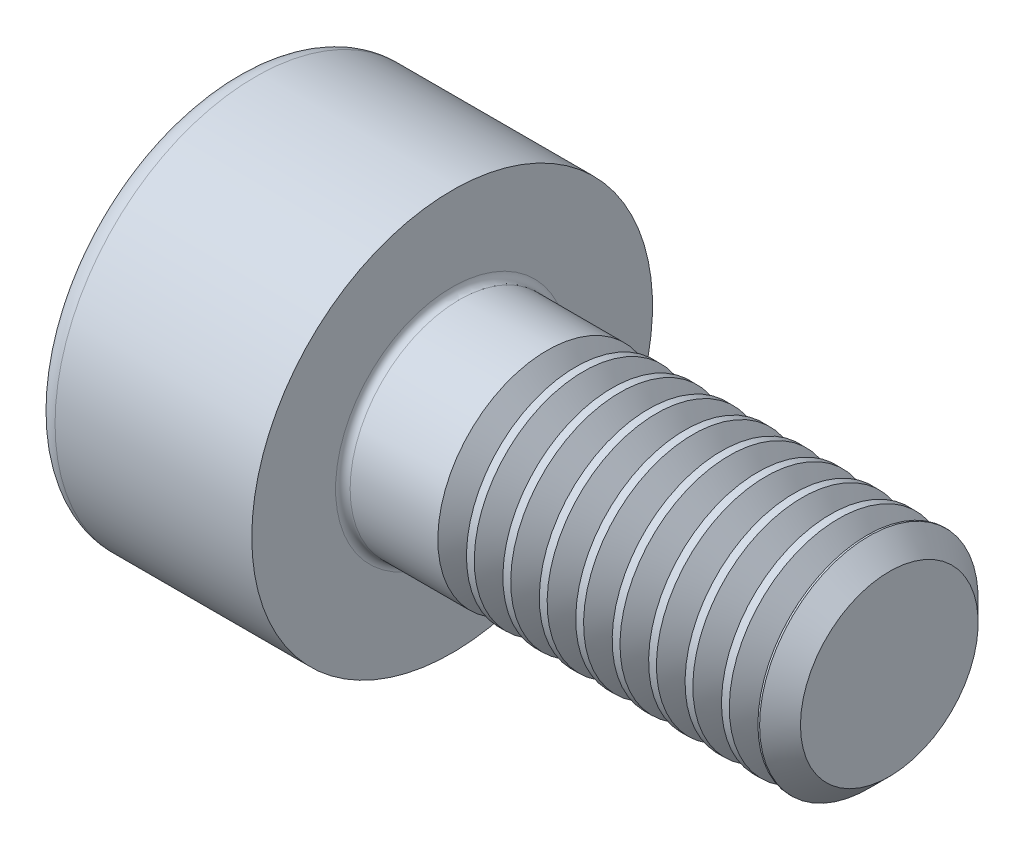
ISO-10303-21;
HEADER;
FILE_DESCRIPTION(('STEP AP214'),'2;1');
FILE_NAME('part.step','',(''),(''),'','','');
FILE_SCHEMA(('AUTOMOTIVE_DESIGN { 1 0 10303 214 1 1 1 1 }'));
ENDSEC;
DATA;
#1=APPLICATION_CONTEXT('core data for automotive mechanical design processes');
#2=APPLICATION_PROTOCOL_DEFINITION('international standard','automotive_design',2000,#1);
#3=PRODUCT_CONTEXT('',#1,'mechanical');
#4=PRODUCT('Part','Part','',(#3));
#5=PRODUCT_RELATED_PRODUCT_CATEGORY('part','',(#4));
#6=PRODUCT_DEFINITION_FORMATION('','',#4);
#7=PRODUCT_DEFINITION_CONTEXT('part definition',#1,'design');
#8=PRODUCT_DEFINITION('design','',#6,#7);
#9=PRODUCT_DEFINITION_SHAPE('','',#8);
#10=(LENGTH_UNIT() NAMED_UNIT(*) SI_UNIT(.MILLI.,.METRE.));
#11=(NAMED_UNIT(*) PLANE_ANGLE_UNIT() SI_UNIT($,.RADIAN.));
#12=(NAMED_UNIT(*) SI_UNIT($,.STERADIAN.) SOLID_ANGLE_UNIT());
#13=UNCERTAINTY_MEASURE_WITH_UNIT(LENGTH_MEASURE(1.E-05),#10,'distance_accuracy_value','');
#14=(GEOMETRIC_REPRESENTATION_CONTEXT(3) GLOBAL_UNCERTAINTY_ASSIGNED_CONTEXT((#13)) GLOBAL_UNIT_ASSIGNED_CONTEXT((#10,
#11,#12)) REPRESENTATION_CONTEXT('',''));
#15=CARTESIAN_POINT('',(0.,0.,0.));
#16=DIRECTION('',(0.,0.,1.));
#17=DIRECTION('',(1.,0.,0.));
#18=AXIS2_PLACEMENT_3D('',#15,#16,#17);
#19=CARTESIAN_POINT('',(0.,0.,0.));
#20=DIRECTION('',(-1.,0.,0.));
#21=DIRECTION('',(0.,0.,1.));
#22=AXIS2_PLACEMENT_3D('',#19,#20,#21);
#23=PLANE('',#22);
#24=DIRECTION('',(0.,-0.499999999999999,0.866025403784439));
#25=VECTOR('',#24,1.);
#26=CARTESIAN_POINT('',(0.,1.45492267835785,0.));
#27=LINE('',#26,#25);
#28=CARTESIAN_POINT('',(0.,1.45492267835785,0.));
#29=VERTEX_POINT('',#28);
#30=CARTESIAN_POINT('',(0.,0.727461339178925,1.26));
#31=VERTEX_POINT('',#30);
#32=EDGE_CURVE('E389',#29,#31,#27,.T.);
#33=ORIENTED_EDGE('',*,*,#32,.T.);
#34=DIRECTION('',(0.,1.,0.));
#35=VECTOR('',#34,1.);
#36=CARTESIAN_POINT('',(0.,-0.727461339178932,1.26));
#37=LINE('',#36,#35);
#38=CARTESIAN_POINT('',(0.,-0.727461339178932,1.26));
#39=VERTEX_POINT('',#38);
#40=EDGE_CURVE('E130',#39,#31,#37,.T.);
#41=ORIENTED_EDGE('',*,*,#40,.F.);
#42=DIRECTION('',(0.,-0.500000000000001,-0.866025403784438));
#43=VECTOR('',#42,1.);
#44=CARTESIAN_POINT('',(0.,-0.727461339178932,1.26));
#45=LINE('',#44,#43);
#46=CARTESIAN_POINT('',(0.,-1.45492267835786,0.));
#47=VERTEX_POINT('',#46);
#48=EDGE_CURVE('E408',#39,#47,#45,.T.);
#49=ORIENTED_EDGE('',*,*,#48,.T.);
#50=DIRECTION('',(0.,0.499999999999999,-0.866025403784439));
#51=VECTOR('',#50,1.);
#52=CARTESIAN_POINT('',(0.,-1.45492267835786,0.));
#53=LINE('',#52,#51);
#54=CARTESIAN_POINT('',(0.,-0.727461339178935,-1.26));
#55=VERTEX_POINT('',#54);
#56=EDGE_CURVE('E411',#47,#55,#53,.T.);
#57=ORIENTED_EDGE('',*,*,#56,.T.);
#58=DIRECTION('',(0.,-1.,0.));
#59=VECTOR('',#58,1.);
#60=CARTESIAN_POINT('',(0.,0.727461339178922,-1.26));
#61=LINE('',#60,#59);
#62=CARTESIAN_POINT('',(0.,0.727461339178922,-1.26));
#63=VERTEX_POINT('',#62);
#64=EDGE_CURVE('E414',#63,#55,#61,.T.);
#65=ORIENTED_EDGE('',*,*,#64,.F.);
#66=DIRECTION('',(0.,-0.500000000000001,-0.866025403784438));
#67=VECTOR('',#66,1.);
#68=CARTESIAN_POINT('',(0.,1.45492267835785,0.));
#69=LINE('',#68,#67);
#70=EDGE_CURVE('E125',#29,#63,#69,.T.);
#71=ORIENTED_EDGE('',*,*,#70,.F.);
#72=EDGE_LOOP('',(#33,#41,#49,#57,#65,#71));
#73=FACE_BOUND('',#72,.T.);
#74=CARTESIAN_POINT('',(0.,0.,0.));
#75=DIRECTION('',(-1.,0.,0.));
#76=DIRECTION('',(0.,0.,1.));
#77=AXIS2_PLACEMENT_3D('',#74,#75,#76);
#78=CIRCLE('',#77,2.45);
#79=CARTESIAN_POINT('',(0.,0.,2.45));
#80=VERTEX_POINT('',#79);
#81=EDGE_CURVE('E42',#80,#80,#78,.T.);
#82=ORIENTED_EDGE('',*,*,#81,.T.);
#83=EDGE_LOOP('',(#82));
#84=FACE_BOUND('',#83,.T.);
#85=ADVANCED_FACE('F34',(#73,#84),#23,.T.);
#86=CARTESIAN_POINT('',(-31.75,0.,0.));
#87=DIRECTION('',(-1.,0.,0.));
#88=DIRECTION('',(0.,0.,1.));
#89=AXIS2_PLACEMENT_3D('',#86,#87,#88);
#90=CYLINDRICAL_SURFACE('',#89,2.75);
#91=CARTESIAN_POINT('',(0.300000000000002,0.,0.));
#92=DIRECTION('',(-1.,0.,0.));
#93=DIRECTION('',(0.,0.,1.));
#94=AXIS2_PLACEMENT_3D('',#91,#92,#93);
#95=CIRCLE('',#94,2.75);
#96=CARTESIAN_POINT('',(0.300000000000002,0.,2.75));
#97=VERTEX_POINT('',#96);
#98=EDGE_CURVE('E11',#97,#97,#95,.F.);
#99=ORIENTED_EDGE('',*,*,#98,.T.);
#100=EDGE_LOOP('',(#99));
#101=FACE_BOUND('',#100,.T.);
#102=CARTESIAN_POINT('',(3.,0.,0.));
#103=DIRECTION('',(-1.,0.,0.));
#104=DIRECTION('',(0.,0.,1.));
#105=AXIS2_PLACEMENT_3D('',#102,#103,#104);
#106=CIRCLE('',#105,2.75);
#107=CARTESIAN_POINT('',(3.,0.,2.75));
#108=VERTEX_POINT('',#107);
#109=EDGE_CURVE('E148',#108,#108,#106,.T.);
#110=ORIENTED_EDGE('',*,*,#109,.T.);
#111=EDGE_LOOP('',(#110));
#112=FACE_BOUND('',#111,.T.);
#113=ADVANCED_FACE('F172',(#101,#112),#90,.T.);
#114=CARTESIAN_POINT('',(3.,2.75,0.));
#115=DIRECTION('',(1.,0.,0.));
#116=DIRECTION('',(0.,0.,-1.));
#117=AXIS2_PLACEMENT_3D('',#114,#115,#116);
#118=PLANE('',#117);
#119=CARTESIAN_POINT('',(3.,0.,0.));
#120=DIRECTION('',(1.,0.,0.));
#121=DIRECTION('',(0.,0.,-1.));
#122=AXIS2_PLACEMENT_3D('',#119,#120,#121);
#123=CIRCLE('',#122,1.6);
#124=CARTESIAN_POINT('',(3.,0.,-1.6));
#125=VERTEX_POINT('',#124);
#126=EDGE_CURVE('E151',#125,#125,#123,.F.);
#127=ORIENTED_EDGE('',*,*,#126,.T.);
#128=EDGE_LOOP('',(#127));
#129=FACE_BOUND('',#128,.T.);
#130=ORIENTED_EDGE('',*,*,#109,.F.);
#131=EDGE_LOOP('',(#130));
#132=FACE_BOUND('',#131,.T.);
#133=ADVANCED_FACE('F178',(#129,#132),#118,.T.);
#134=CARTESIAN_POINT('',(-31.75,0.,0.));
#135=DIRECTION('',(-1.,0.,0.));
#136=DIRECTION('',(0.,0.,1.));
#137=AXIS2_PLACEMENT_3D('',#134,#135,#136);
#138=CYLINDRICAL_SURFACE('',#137,1.5);
#139=CARTESIAN_POINT('',(4.30359178553217,0.,0.));
#140=DIRECTION('',(-1.,0.,0.));
#141=DIRECTION('',(0.,-1.,0.));
#142=AXIS2_PLACEMENT_3D('',#139,#140,#141);
#143=CIRCLE('',#142,1.5);
#144=CARTESIAN_POINT('',(4.30359178553217,-1.5,0.));
#145=VERTEX_POINT('',#144);
#146=EDGE_CURVE('E384',#145,#145,#143,.T.);
#147=ORIENTED_EDGE('',*,*,#146,.T.);
#148=EDGE_LOOP('',(#147));
#149=FACE_BOUND('',#148,.T.);
#150=CARTESIAN_POINT('',(3.10000000000001,0.,0.));
#151=DIRECTION('',(1.,0.,0.));
#152=DIRECTION('',(0.,0.,-1.));
#153=AXIS2_PLACEMENT_3D('',#150,#151,#152);
#154=CIRCLE('',#153,1.5);
#155=CARTESIAN_POINT('',(3.10000000000001,0.,-1.5));
#156=VERTEX_POINT('',#155);
#157=EDGE_CURVE('E154',#156,#156,#154,.T.);
#158=ORIENTED_EDGE('',*,*,#157,.T.);
#159=EDGE_LOOP('',(#158));
#160=FACE_BOUND('',#159,.T.);
#161=ADVANCED_FACE('F168',(#149,#160),#138,.T.);
#162=CARTESIAN_POINT('',(3.10000000000001,0.,0.));
#163=DIRECTION('',(1.,0.,0.));
#164=DIRECTION('',(0.,0.,-1.));
#165=AXIS2_PLACEMENT_3D('',#162,#163,#164);
#166=TOROIDAL_SURFACE('',#165,1.6,0.1);
#167=ORIENTED_EDGE('',*,*,#157,.F.);
#168=EDGE_LOOP('',(#167));
#169=FACE_BOUND('',#168,.T.);
#170=ORIENTED_EDGE('',*,*,#126,.F.);
#171=EDGE_LOOP('',(#170));
#172=FACE_BOUND('',#171,.T.);
#173=ADVANCED_FACE('F161',(#169,#172),#166,.F.);
#174=CARTESIAN_POINT('',(0.300000000000002,0.,0.));
#175=DIRECTION('',(-1.,0.,0.));
#176=DIRECTION('',(0.,0.,1.));
#177=AXIS2_PLACEMENT_3D('',#174,#175,#176);
#178=TOROIDAL_SURFACE('',#177,2.45,0.3);
#179=ORIENTED_EDGE('',*,*,#98,.F.);
#180=EDGE_LOOP('',(#179));
#181=FACE_BOUND('',#180,.T.);
#182=ORIENTED_EDGE('',*,*,#81,.F.);
#183=EDGE_LOOP('',(#182));
#184=FACE_BOUND('',#183,.T.);
#185=ADVANCED_FACE('F36',(#181,#184),#178,.T.);
#186=CARTESIAN_POINT('',(1.3,1.45492267835785,0.));
#187=DIRECTION('',(0.,-0.866025403784439,-0.499999999999999));
#188=DIRECTION('',(0.,0.499999999999999,-0.866025403784439));
#189=AXIS2_PLACEMENT_3D('',#186,#187,#188);
#190=PLANE('',#189);
#191=ORIENTED_EDGE('',*,*,#32,.F.);
#192=DIRECTION('',(-1.,0.,0.));
#193=VECTOR('',#192,1.);
#194=CARTESIAN_POINT('',(1.3,1.45492267835785,0.));
#195=LINE('',#194,#193);
#196=CARTESIAN_POINT('',(1.3,1.45492267835785,0.));
#197=VERTEX_POINT('',#196);
#198=EDGE_CURVE('E405',#197,#29,#195,.T.);
#199=ORIENTED_EDGE('',*,*,#198,.F.);
#200=DIRECTION('',(0.,-0.499999999999999,0.866025403784439));
#201=VECTOR('',#200,1.);
#202=CARTESIAN_POINT('',(1.3,1.45492267835785,0.));
#203=LINE('',#202,#201);
#204=CARTESIAN_POINT('',(1.3,1.09119200876839,0.629999999999996));
#205=VERTEX_POINT('',#204);
#206=EDGE_CURVE('E117',#197,#205,#203,.T.);
#207=ORIENTED_EDGE('',*,*,#206,.T.);
#208=CARTESIAN_POINT('',(1.3,0.727461339178925,1.26));
#209=VERTEX_POINT('',#208);
#210=EDGE_CURVE('E108',#205,#209,#203,.T.);
#211=ORIENTED_EDGE('',*,*,#210,.T.);
#212=DIRECTION('',(-1.,0.,0.));
#213=VECTOR('',#212,1.);
#214=CARTESIAN_POINT('',(1.3,0.727461339178925,1.26));
#215=LINE('',#214,#213);
#216=EDGE_CURVE('E122',#209,#31,#215,.T.);
#217=ORIENTED_EDGE('',*,*,#216,.T.);
#218=EDGE_LOOP('',(#191,#199,#207,#211,#217));
#219=FACE_BOUND('',#218,.T.);
#220=ADVANCED_FACE('F121',(#219),#190,.T.);
#221=CARTESIAN_POINT('',(1.3,-0.727461339178932,1.26));
#222=DIRECTION('',(0.,0.,1.));
#223=DIRECTION('',(0.,-1.,0.));
#224=AXIS2_PLACEMENT_3D('',#221,#222,#223);
#225=PLANE('',#224);
#226=ORIENTED_EDGE('',*,*,#40,.T.);
#227=ORIENTED_EDGE('',*,*,#216,.F.);
#228=DIRECTION('',(0.,1.,0.));
#229=VECTOR('',#228,1.);
#230=CARTESIAN_POINT('',(1.3,-0.727461339178932,1.26));
#231=LINE('',#230,#229);
#232=CARTESIAN_POINT('',(1.3,0.,1.26));
#233=VERTEX_POINT('',#232);
#234=EDGE_CURVE('E105',#233,#209,#231,.T.);
#235=ORIENTED_EDGE('',*,*,#234,.F.);
#236=CARTESIAN_POINT('',(1.3,-0.727461339178932,1.26));
#237=VERTEX_POINT('',#236);
#238=EDGE_CURVE('E116',#237,#233,#231,.T.);
#239=ORIENTED_EDGE('',*,*,#238,.F.);
#240=DIRECTION('',(-1.,0.,0.));
#241=VECTOR('',#240,1.);
#242=CARTESIAN_POINT('',(1.3,-0.727461339178932,1.26));
#243=LINE('',#242,#241);
#244=EDGE_CURVE('E132',#237,#39,#243,.T.);
#245=ORIENTED_EDGE('',*,*,#244,.T.);
#246=EDGE_LOOP('',(#226,#227,#235,#239,#245));
#247=FACE_BOUND('',#246,.T.);
#248=ADVANCED_FACE('F127',(#247),#225,.F.);
#249=CARTESIAN_POINT('',(1.3,-0.727461339178932,1.26));
#250=DIRECTION('',(0.,0.866025403784438,-0.500000000000001));
#251=DIRECTION('',(0.,0.500000000000001,0.866025403784438));
#252=AXIS2_PLACEMENT_3D('',#249,#250,#251);
#253=PLANE('',#252);
#254=ORIENTED_EDGE('',*,*,#48,.F.);
#255=ORIENTED_EDGE('',*,*,#244,.F.);
#256=DIRECTION('',(0.,-0.500000000000001,-0.866025403784438));
#257=VECTOR('',#256,1.);
#258=CARTESIAN_POINT('',(1.3,-0.727461339178932,1.26));
#259=LINE('',#258,#257);
#260=CARTESIAN_POINT('',(1.3,-1.0911920087684,0.630000000000003));
#261=VERTEX_POINT('',#260);
#262=EDGE_CURVE('E392',#237,#261,#259,.T.);
#263=ORIENTED_EDGE('',*,*,#262,.T.);
#264=CARTESIAN_POINT('',(1.3,-1.45492267835786,0.));
#265=VERTEX_POINT('',#264);
#266=EDGE_CURVE('E391',#261,#265,#259,.T.);
#267=ORIENTED_EDGE('',*,*,#266,.T.);
#268=DIRECTION('',(-1.,0.,0.));
#269=VECTOR('',#268,1.);
#270=CARTESIAN_POINT('',(1.3,-1.45492267835786,0.));
#271=LINE('',#270,#269);
#272=EDGE_CURVE('E137',#265,#47,#271,.T.);
#273=ORIENTED_EDGE('',*,*,#272,.T.);
#274=EDGE_LOOP('',(#254,#255,#263,#267,#273));
#275=FACE_BOUND('',#274,.T.);
#276=ADVANCED_FACE('F206',(#275),#253,.T.);
#277=CARTESIAN_POINT('',(1.3,-1.45492267835786,0.));
#278=DIRECTION('',(0.,0.866025403784439,0.499999999999999));
#279=DIRECTION('',(0.,-0.499999999999999,0.866025403784439));
#280=AXIS2_PLACEMENT_3D('',#277,#278,#279);
#281=PLANE('',#280);
#282=ORIENTED_EDGE('',*,*,#56,.F.);
#283=ORIENTED_EDGE('',*,*,#272,.F.);
#284=DIRECTION('',(0.,0.499999999999999,-0.866025403784439));
#285=VECTOR('',#284,1.);
#286=CARTESIAN_POINT('',(1.3,-1.45492267835786,0.));
#287=LINE('',#286,#285);
#288=CARTESIAN_POINT('',(1.3,-1.0911920087684,-0.630000000000001));
#289=VERTEX_POINT('',#288);
#290=EDGE_CURVE('E396',#265,#289,#287,.T.);
#291=ORIENTED_EDGE('',*,*,#290,.T.);
#292=CARTESIAN_POINT('',(1.3,-0.727461339178935,-1.26));
#293=VERTEX_POINT('',#292);
#294=EDGE_CURVE('E395',#289,#293,#287,.T.);
#295=ORIENTED_EDGE('',*,*,#294,.T.);
#296=DIRECTION('',(-1.,0.,0.));
#297=VECTOR('',#296,1.);
#298=CARTESIAN_POINT('',(1.3,-0.727461339178935,-1.26));
#299=LINE('',#298,#297);
#300=EDGE_CURVE('E423',#293,#55,#299,.T.);
#301=ORIENTED_EDGE('',*,*,#300,.T.);
#302=EDGE_LOOP('',(#282,#283,#291,#295,#301));
#303=FACE_BOUND('',#302,.T.);
#304=ADVANCED_FACE('F209',(#303),#281,.T.);
#305=CARTESIAN_POINT('',(1.3,0.727461339178922,-1.26));
#306=DIRECTION('',(0.,0.,-1.));
#307=DIRECTION('',(0.,1.,0.));
#308=AXIS2_PLACEMENT_3D('',#305,#306,#307);
#309=PLANE('',#308);
#310=ORIENTED_EDGE('',*,*,#64,.T.);
#311=ORIENTED_EDGE('',*,*,#300,.F.);
#312=DIRECTION('',(0.,-1.,0.));
#313=VECTOR('',#312,1.);
#314=CARTESIAN_POINT('',(1.3,0.727461339178922,-1.26));
#315=LINE('',#314,#313);
#316=CARTESIAN_POINT('',(1.3,0.,-1.26));
#317=VERTEX_POINT('',#316);
#318=EDGE_CURVE('E399',#317,#293,#315,.T.);
#319=ORIENTED_EDGE('',*,*,#318,.F.);
#320=CARTESIAN_POINT('',(1.3,0.727461339178922,-1.26));
#321=VERTEX_POINT('',#320);
#322=EDGE_CURVE('E49',#321,#317,#315,.T.);
#323=ORIENTED_EDGE('',*,*,#322,.F.);
#324=DIRECTION('',(-1.,0.,0.));
#325=VECTOR('',#324,1.);
#326=CARTESIAN_POINT('',(1.3,0.727461339178922,-1.26));
#327=LINE('',#326,#325);
#328=EDGE_CURVE('E420',#321,#63,#327,.T.);
#329=ORIENTED_EDGE('',*,*,#328,.T.);
#330=EDGE_LOOP('',(#310,#311,#319,#323,#329));
#331=FACE_BOUND('',#330,.T.);
#332=ADVANCED_FACE('F213',(#331),#309,.F.);
#333=CARTESIAN_POINT('',(1.3,1.45492267835785,0.));
#334=DIRECTION('',(0.,0.866025403784438,-0.500000000000001));
#335=DIRECTION('',(0.,0.500000000000001,0.866025403784438));
#336=AXIS2_PLACEMENT_3D('',#333,#334,#335);
#337=PLANE('',#336);
#338=ORIENTED_EDGE('',*,*,#70,.T.);
#339=ORIENTED_EDGE('',*,*,#328,.F.);
#340=DIRECTION('',(0.,-0.500000000000001,-0.866025403784438));
#341=VECTOR('',#340,1.);
#342=CARTESIAN_POINT('',(1.3,1.45492267835785,0.));
#343=LINE('',#342,#341);
#344=CARTESIAN_POINT('',(1.3,1.09119200876839,-0.629999999999999));
#345=VERTEX_POINT('',#344);
#346=EDGE_CURVE('E401',#345,#321,#343,.T.);
#347=ORIENTED_EDGE('',*,*,#346,.F.);
#348=EDGE_CURVE('E402',#197,#345,#343,.T.);
#349=ORIENTED_EDGE('',*,*,#348,.F.);
#350=ORIENTED_EDGE('',*,*,#198,.T.);
#351=EDGE_LOOP('',(#338,#339,#347,#349,#350));
#352=FACE_BOUND('',#351,.T.);
#353=ADVANCED_FACE('F217',(#352),#337,.F.);
#354=CARTESIAN_POINT('',(1.3,2.18238401753678,-1.26));
#355=DIRECTION('',(1.,0.,0.));
#356=DIRECTION('',(0.,0.,-1.));
#357=AXIS2_PLACEMENT_3D('',#354,#355,#356);
#358=PLANE('',#357);
#359=ORIENTED_EDGE('',*,*,#318,.T.);
#360=ORIENTED_EDGE('',*,*,#294,.F.);
#361=CARTESIAN_POINT('',(1.3,0.,0.));
#362=DIRECTION('',(-1.,0.,0.));
#363=DIRECTION('',(0.,0.,1.));
#364=AXIS2_PLACEMENT_3D('',#361,#362,#363);
#365=CIRCLE('',#364,1.26);
#366=EDGE_CURVE('E440',#317,#289,#365,.T.);
#367=ORIENTED_EDGE('',*,*,#366,.F.);
#368=EDGE_LOOP('',(#359,#360,#367));
#369=FACE_BOUND('',#368,.T.);
#370=ADVANCED_FACE('F221',(#369),#358,.F.);
#371=ORIENTED_EDGE('',*,*,#290,.F.);
#372=ORIENTED_EDGE('',*,*,#266,.F.);
#373=EDGE_CURVE('E135',#289,#261,#365,.T.);
#374=ORIENTED_EDGE('',*,*,#373,.F.);
#375=EDGE_LOOP('',(#371,#372,#374));
#376=FACE_BOUND('',#375,.T.);
#377=ADVANCED_FACE('F225',(#376),#358,.F.);
#378=ORIENTED_EDGE('',*,*,#262,.F.);
#379=ORIENTED_EDGE('',*,*,#238,.T.);
#380=EDGE_CURVE('E131',#261,#233,#365,.T.);
#381=ORIENTED_EDGE('',*,*,#380,.F.);
#382=EDGE_LOOP('',(#378,#379,#381));
#383=FACE_BOUND('',#382,.T.);
#384=ADVANCED_FACE('F449',(#383),#358,.F.);
#385=ORIENTED_EDGE('',*,*,#234,.T.);
#386=ORIENTED_EDGE('',*,*,#210,.F.);
#387=EDGE_CURVE('E111',#233,#205,#365,.T.);
#388=ORIENTED_EDGE('',*,*,#387,.F.);
#389=EDGE_LOOP('',(#385,#386,#388));
#390=FACE_BOUND('',#389,.T.);
#391=ADVANCED_FACE('F107',(#390),#358,.F.);
#392=ORIENTED_EDGE('',*,*,#206,.F.);
#393=ORIENTED_EDGE('',*,*,#348,.T.);
#394=EDGE_CURVE('E142',#205,#345,#365,.T.);
#395=ORIENTED_EDGE('',*,*,#394,.F.);
#396=EDGE_LOOP('',(#392,#393,#395));
#397=FACE_BOUND('',#396,.T.);
#398=ADVANCED_FACE('F435',(#397),#358,.F.);
#399=ORIENTED_EDGE('',*,*,#346,.T.);
#400=ORIENTED_EDGE('',*,*,#322,.T.);
#401=EDGE_CURVE('E439',#345,#317,#365,.T.);
#402=ORIENTED_EDGE('',*,*,#401,.F.);
#403=EDGE_LOOP('',(#399,#400,#402));
#404=FACE_BOUND('',#403,.T.);
#405=ADVANCED_FACE('F202',(#404),#358,.F.);
#406=CARTESIAN_POINT('',(1.3,0.,0.));
#407=DIRECTION('',(-1.,0.,0.));
#408=DIRECTION('',(0.,0.,1.));
#409=AXIS2_PLACEMENT_3D('',#406,#407,#408);
#410=CONICAL_SURFACE('',#409,1.26,1.04719755119659);
#411=CARTESIAN_POINT('',(2.02746133917894,0.,0.));
#412=VERTEX_POINT('',#411);
#413=VERTEX_LOOP('',#412);
#414=FACE_BOUND('',#413,.T.);
#415=ORIENTED_EDGE('',*,*,#387,.T.);
#416=ORIENTED_EDGE('',*,*,#394,.T.);
#417=ORIENTED_EDGE('',*,*,#401,.T.);
#418=ORIENTED_EDGE('',*,*,#366,.T.);
#419=ORIENTED_EDGE('',*,*,#373,.T.);
#420=ORIENTED_EDGE('',*,*,#380,.T.);
#421=EDGE_LOOP('',(#415,#416,#417,#418,#419,#420));
#422=FACE_BOUND('',#421,.T.);
#423=ADVANCED_FACE('F199',(#414,#422),#410,.F.);
#424=CARTESIAN_POINT('',(4.69640821446782,0.,0.));
#425=DIRECTION('',(1.,0.,0.));
#426=DIRECTION('',(0.,1.,0.));
#427=AXIS2_PLACEMENT_3D('',#424,#425,#426);
#428=CONICAL_SURFACE('',#427,1.5,0.959931088596884);
#429=CARTESIAN_POINT('',(4.5,0.,0.));
#430=DIRECTION('',(-1.,0.,0.));
#431=DIRECTION('',(0.,-1.,0.));
#432=AXIS2_PLACEMENT_3D('',#429,#430,#431);
#433=CIRCLE('',#432,1.2195);
#434=CARTESIAN_POINT('',(4.5,-1.2195,0.));
#435=VERTEX_POINT('',#434);
#436=EDGE_CURVE('E381',#435,#435,#433,.T.);
#437=ORIENTED_EDGE('',*,*,#436,.F.);
#438=EDGE_LOOP('',(#437));
#439=FACE_BOUND('',#438,.T.);
#440=CARTESIAN_POINT('',(4.69640821446782,0.,0.));
#441=DIRECTION('',(-1.,0.,0.));
#442=DIRECTION('',(0.,-1.,0.));
#443=AXIS2_PLACEMENT_3D('',#440,#441,#442);
#444=CIRCLE('',#443,1.5);
#445=CARTESIAN_POINT('',(4.69640821446782,-1.5,0.));
#446=VERTEX_POINT('',#445);
#447=EDGE_CURVE('E387',#446,#446,#444,.T.);
#448=ORIENTED_EDGE('',*,*,#447,.T.);
#449=EDGE_LOOP('',(#448));
#450=FACE_BOUND('',#449,.T.);
#451=ADVANCED_FACE('F201',(#439,#450),#428,.T.);
#452=CARTESIAN_POINT('',(4.5,0.,0.));
#453=DIRECTION('',(-1.,0.,0.));
#454=DIRECTION('',(0.,-1.,0.));
#455=AXIS2_PLACEMENT_3D('',#452,#453,#454);
#456=CONICAL_SURFACE('',#455,1.2195,0.959931088596874);
#457=ORIENTED_EDGE('',*,*,#146,.F.);
#458=EDGE_LOOP('',(#457));
#459=FACE_BOUND('',#458,.T.);
#460=ORIENTED_EDGE('',*,*,#436,.T.);
#461=EDGE_LOOP('',(#460));
#462=FACE_BOUND('',#461,.T.);
#463=ADVANCED_FACE('F229',(#459,#462),#456,.T.);
#464=CARTESIAN_POINT('',(4.80359178553217,0.,0.));
#465=DIRECTION('',(-1.,0.,0.));
#466=DIRECTION('',(0.,-1.,0.));
#467=AXIS2_PLACEMENT_3D('',#464,#465,#466);
#468=CIRCLE('',#467,1.5);
#469=CARTESIAN_POINT('',(4.80359178553217,-1.5,0.));
#470=VERTEX_POINT('',#469);
#471=EDGE_CURVE('E375',#470,#470,#468,.T.);
#472=ORIENTED_EDGE('',*,*,#471,.T.);
#473=EDGE_LOOP('',(#472));
#474=FACE_BOUND('',#473,.T.);
#475=ORIENTED_EDGE('',*,*,#447,.F.);
#476=EDGE_LOOP('',(#475));
#477=FACE_BOUND('',#476,.T.);
#478=ADVANCED_FACE('F189',(#474,#477),#138,.T.);
#479=CARTESIAN_POINT('',(5.19640821446782,0.,0.));
#480=DIRECTION('',(1.,0.,0.));
#481=DIRECTION('',(0.,1.,0.));
#482=AXIS2_PLACEMENT_3D('',#479,#480,#481);
#483=CONICAL_SURFACE('',#482,1.5,0.959931088596884);
#484=CARTESIAN_POINT('',(5.,0.,0.));
#485=DIRECTION('',(-1.,0.,0.));
#486=DIRECTION('',(0.,-1.,0.));
#487=AXIS2_PLACEMENT_3D('',#484,#485,#486);
#488=CIRCLE('',#487,1.2195);
#489=CARTESIAN_POINT('',(5.,-1.2195,0.));
#490=VERTEX_POINT('',#489);
#491=EDGE_CURVE('E372',#490,#490,#488,.T.);
#492=ORIENTED_EDGE('',*,*,#491,.F.);
#493=EDGE_LOOP('',(#492));
#494=FACE_BOUND('',#493,.T.);
#495=CARTESIAN_POINT('',(5.19640821446782,0.,0.));
#496=DIRECTION('',(-1.,0.,0.));
#497=DIRECTION('',(0.,-1.,0.));
#498=AXIS2_PLACEMENT_3D('',#495,#496,#497);
#499=CIRCLE('',#498,1.5);
#500=CARTESIAN_POINT('',(5.19640821446782,-1.5,0.));
#501=VERTEX_POINT('',#500);
#502=EDGE_CURVE('E378',#501,#501,#499,.T.);
#503=ORIENTED_EDGE('',*,*,#502,.T.);
#504=EDGE_LOOP('',(#503));
#505=FACE_BOUND('',#504,.T.);
#506=ADVANCED_FACE('F234',(#494,#505),#483,.T.);
#507=CARTESIAN_POINT('',(5.,0.,0.));
#508=DIRECTION('',(-1.,0.,0.));
#509=DIRECTION('',(0.,-1.,0.));
#510=AXIS2_PLACEMENT_3D('',#507,#508,#509);
#511=CONICAL_SURFACE('',#510,1.2195,0.959931088596874);
#512=ORIENTED_EDGE('',*,*,#471,.F.);
#513=EDGE_LOOP('',(#512));
#514=FACE_BOUND('',#513,.T.);
#515=ORIENTED_EDGE('',*,*,#491,.T.);
#516=EDGE_LOOP('',(#515));
#517=FACE_BOUND('',#516,.T.);
#518=ADVANCED_FACE('F237',(#514,#517),#511,.T.);
#519=CARTESIAN_POINT('',(5.30359178553217,0.,0.));
#520=DIRECTION('',(-1.,0.,0.));
#521=DIRECTION('',(0.,-1.,0.));
#522=AXIS2_PLACEMENT_3D('',#519,#520,#521);
#523=CIRCLE('',#522,1.5);
#524=CARTESIAN_POINT('',(5.30359178553217,-1.5,0.));
#525=VERTEX_POINT('',#524);
#526=EDGE_CURVE('E366',#525,#525,#523,.T.);
#527=ORIENTED_EDGE('',*,*,#526,.T.);
#528=EDGE_LOOP('',(#527));
#529=FACE_BOUND('',#528,.T.);
#530=ORIENTED_EDGE('',*,*,#502,.F.);
#531=EDGE_LOOP('',(#530));
#532=FACE_BOUND('',#531,.T.);
#533=ADVANCED_FACE('F241',(#529,#532),#138,.T.);
#534=CARTESIAN_POINT('',(5.69640821446782,0.,0.));
#535=DIRECTION('',(1.,0.,0.));
#536=DIRECTION('',(0.,1.,0.));
#537=AXIS2_PLACEMENT_3D('',#534,#535,#536);
#538=CONICAL_SURFACE('',#537,1.5,0.959931088596884);
#539=CARTESIAN_POINT('',(5.5,0.,0.));
#540=DIRECTION('',(-1.,0.,0.));
#541=DIRECTION('',(0.,-1.,0.));
#542=AXIS2_PLACEMENT_3D('',#539,#540,#541);
#543=CIRCLE('',#542,1.2195);
#544=CARTESIAN_POINT('',(5.5,-1.2195,0.));
#545=VERTEX_POINT('',#544);
#546=EDGE_CURVE('E363',#545,#545,#543,.T.);
#547=ORIENTED_EDGE('',*,*,#546,.F.);
#548=EDGE_LOOP('',(#547));
#549=FACE_BOUND('',#548,.T.);
#550=CARTESIAN_POINT('',(5.69640821446782,0.,0.));
#551=DIRECTION('',(-1.,0.,0.));
#552=DIRECTION('',(0.,-1.,0.));
#553=AXIS2_PLACEMENT_3D('',#550,#551,#552);
#554=CIRCLE('',#553,1.5);
#555=CARTESIAN_POINT('',(5.69640821446782,-1.5,0.));
#556=VERTEX_POINT('',#555);
#557=EDGE_CURVE('E369',#556,#556,#554,.T.);
#558=ORIENTED_EDGE('',*,*,#557,.T.);
#559=EDGE_LOOP('',(#558));
#560=FACE_BOUND('',#559,.T.);
#561=ADVANCED_FACE('F243',(#549,#560),#538,.T.);
#562=CARTESIAN_POINT('',(5.5,0.,0.));
#563=DIRECTION('',(-1.,0.,0.));
#564=DIRECTION('',(0.,-1.,0.));
#565=AXIS2_PLACEMENT_3D('',#562,#563,#564);
#566=CONICAL_SURFACE('',#565,1.2195,0.959931088596874);
#567=ORIENTED_EDGE('',*,*,#526,.F.);
#568=EDGE_LOOP('',(#567));
#569=FACE_BOUND('',#568,.T.);
#570=ORIENTED_EDGE('',*,*,#546,.T.);
#571=EDGE_LOOP('',(#570));
#572=FACE_BOUND('',#571,.T.);
#573=ADVANCED_FACE('F246',(#569,#572),#566,.T.);
#574=CARTESIAN_POINT('',(5.80359178553217,0.,0.));
#575=DIRECTION('',(-1.,0.,0.));
#576=DIRECTION('',(0.,-1.,0.));
#577=AXIS2_PLACEMENT_3D('',#574,#575,#576);
#578=CIRCLE('',#577,1.5);
#579=CARTESIAN_POINT('',(5.80359178553217,-1.5,0.));
#580=VERTEX_POINT('',#579);
#581=EDGE_CURVE('E357',#580,#580,#578,.T.);
#582=ORIENTED_EDGE('',*,*,#581,.T.);
#583=EDGE_LOOP('',(#582));
#584=FACE_BOUND('',#583,.T.);
#585=ORIENTED_EDGE('',*,*,#557,.F.);
#586=EDGE_LOOP('',(#585));
#587=FACE_BOUND('',#586,.T.);
#588=ADVANCED_FACE('F250',(#584,#587),#138,.T.);
#589=CARTESIAN_POINT('',(6.19640821446782,0.,0.));
#590=DIRECTION('',(1.,0.,0.));
#591=DIRECTION('',(0.,1.,0.));
#592=AXIS2_PLACEMENT_3D('',#589,#590,#591);
#593=CONICAL_SURFACE('',#592,1.5,0.959931088596884);
#594=CARTESIAN_POINT('',(6.,0.,0.));
#595=DIRECTION('',(-1.,0.,0.));
#596=DIRECTION('',(0.,-1.,0.));
#597=AXIS2_PLACEMENT_3D('',#594,#595,#596);
#598=CIRCLE('',#597,1.2195);
#599=CARTESIAN_POINT('',(6.,-1.2195,0.));
#600=VERTEX_POINT('',#599);
#601=EDGE_CURVE('E354',#600,#600,#598,.T.);
#602=ORIENTED_EDGE('',*,*,#601,.F.);
#603=EDGE_LOOP('',(#602));
#604=FACE_BOUND('',#603,.T.);
#605=CARTESIAN_POINT('',(6.19640821446782,0.,0.));
#606=DIRECTION('',(-1.,0.,0.));
#607=DIRECTION('',(0.,-1.,0.));
#608=AXIS2_PLACEMENT_3D('',#605,#606,#607);
#609=CIRCLE('',#608,1.5);
#610=CARTESIAN_POINT('',(6.19640821446782,-1.5,0.));
#611=VERTEX_POINT('',#610);
#612=EDGE_CURVE('E360',#611,#611,#609,.T.);
#613=ORIENTED_EDGE('',*,*,#612,.T.);
#614=EDGE_LOOP('',(#613));
#615=FACE_BOUND('',#614,.T.);
#616=ADVANCED_FACE('F252',(#604,#615),#593,.T.);
#617=CARTESIAN_POINT('',(6.,0.,0.));
#618=DIRECTION('',(-1.,0.,0.));
#619=DIRECTION('',(0.,-1.,0.));
#620=AXIS2_PLACEMENT_3D('',#617,#618,#619);
#621=CONICAL_SURFACE('',#620,1.2195,0.959931088596874);
#622=ORIENTED_EDGE('',*,*,#581,.F.);
#623=EDGE_LOOP('',(#622));
#624=FACE_BOUND('',#623,.T.);
#625=ORIENTED_EDGE('',*,*,#601,.T.);
#626=EDGE_LOOP('',(#625));
#627=FACE_BOUND('',#626,.T.);
#628=ADVANCED_FACE('F255',(#624,#627),#621,.T.);
#629=CARTESIAN_POINT('',(6.30359178553217,0.,0.));
#630=DIRECTION('',(-1.,0.,0.));
#631=DIRECTION('',(0.,-1.,0.));
#632=AXIS2_PLACEMENT_3D('',#629,#630,#631);
#633=CIRCLE('',#632,1.5);
#634=CARTESIAN_POINT('',(6.30359178553217,-1.5,0.));
#635=VERTEX_POINT('',#634);
#636=EDGE_CURVE('E348',#635,#635,#633,.T.);
#637=ORIENTED_EDGE('',*,*,#636,.T.);
#638=EDGE_LOOP('',(#637));
#639=FACE_BOUND('',#638,.T.);
#640=ORIENTED_EDGE('',*,*,#612,.F.);
#641=EDGE_LOOP('',(#640));
#642=FACE_BOUND('',#641,.T.);
#643=ADVANCED_FACE('F259',(#639,#642),#138,.T.);
#644=CARTESIAN_POINT('',(6.69640821446782,0.,0.));
#645=DIRECTION('',(1.,0.,0.));
#646=DIRECTION('',(0.,1.,0.));
#647=AXIS2_PLACEMENT_3D('',#644,#645,#646);
#648=CONICAL_SURFACE('',#647,1.5,0.959931088596884);
#649=CARTESIAN_POINT('',(6.5,0.,0.));
#650=DIRECTION('',(-1.,0.,0.));
#651=DIRECTION('',(0.,-1.,0.));
#652=AXIS2_PLACEMENT_3D('',#649,#650,#651);
#653=CIRCLE('',#652,1.2195);
#654=CARTESIAN_POINT('',(6.5,-1.2195,0.));
#655=VERTEX_POINT('',#654);
#656=EDGE_CURVE('E345',#655,#655,#653,.T.);
#657=ORIENTED_EDGE('',*,*,#656,.F.);
#658=EDGE_LOOP('',(#657));
#659=FACE_BOUND('',#658,.T.);
#660=CARTESIAN_POINT('',(6.69640821446782,0.,0.));
#661=DIRECTION('',(-1.,0.,0.));
#662=DIRECTION('',(0.,-1.,0.));
#663=AXIS2_PLACEMENT_3D('',#660,#661,#662);
#664=CIRCLE('',#663,1.5);
#665=CARTESIAN_POINT('',(6.69640821446782,-1.5,0.));
#666=VERTEX_POINT('',#665);
#667=EDGE_CURVE('E351',#666,#666,#664,.T.);
#668=ORIENTED_EDGE('',*,*,#667,.T.);
#669=EDGE_LOOP('',(#668));
#670=FACE_BOUND('',#669,.T.);
#671=ADVANCED_FACE('F261',(#659,#670),#648,.T.);
#672=CARTESIAN_POINT('',(6.5,0.,0.));
#673=DIRECTION('',(-1.,0.,0.));
#674=DIRECTION('',(0.,-1.,0.));
#675=AXIS2_PLACEMENT_3D('',#672,#673,#674);
#676=CONICAL_SURFACE('',#675,1.2195,0.959931088596874);
#677=ORIENTED_EDGE('',*,*,#636,.F.);
#678=EDGE_LOOP('',(#677));
#679=FACE_BOUND('',#678,.T.);
#680=ORIENTED_EDGE('',*,*,#656,.T.);
#681=EDGE_LOOP('',(#680));
#682=FACE_BOUND('',#681,.T.);
#683=ADVANCED_FACE('F264',(#679,#682),#676,.T.);
#684=CARTESIAN_POINT('',(6.80359178553217,0.,0.));
#685=DIRECTION('',(-1.,0.,0.));
#686=DIRECTION('',(0.,-1.,0.));
#687=AXIS2_PLACEMENT_3D('',#684,#685,#686);
#688=CIRCLE('',#687,1.5);
#689=CARTESIAN_POINT('',(6.80359178553217,-1.5,0.));
#690=VERTEX_POINT('',#689);
#691=EDGE_CURVE('E339',#690,#690,#688,.T.);
#692=ORIENTED_EDGE('',*,*,#691,.T.);
#693=EDGE_LOOP('',(#692));
#694=FACE_BOUND('',#693,.T.);
#695=ORIENTED_EDGE('',*,*,#667,.F.);
#696=EDGE_LOOP('',(#695));
#697=FACE_BOUND('',#696,.T.);
#698=ADVANCED_FACE('F268',(#694,#697),#138,.T.);
#699=CARTESIAN_POINT('',(7.19640821446782,0.,0.));
#700=DIRECTION('',(1.,0.,0.));
#701=DIRECTION('',(0.,1.,0.));
#702=AXIS2_PLACEMENT_3D('',#699,#700,#701);
#703=CONICAL_SURFACE('',#702,1.5,0.959931088596884);
#704=CARTESIAN_POINT('',(7.,0.,0.));
#705=DIRECTION('',(-1.,0.,0.));
#706=DIRECTION('',(0.,-1.,0.));
#707=AXIS2_PLACEMENT_3D('',#704,#705,#706);
#708=CIRCLE('',#707,1.2195);
#709=CARTESIAN_POINT('',(7.,-1.2195,0.));
#710=VERTEX_POINT('',#709);
#711=EDGE_CURVE('E336',#710,#710,#708,.T.);
#712=ORIENTED_EDGE('',*,*,#711,.F.);
#713=EDGE_LOOP('',(#712));
#714=FACE_BOUND('',#713,.T.);
#715=CARTESIAN_POINT('',(7.19640821446782,0.,0.));
#716=DIRECTION('',(-1.,0.,0.));
#717=DIRECTION('',(0.,-1.,0.));
#718=AXIS2_PLACEMENT_3D('',#715,#716,#717);
#719=CIRCLE('',#718,1.5);
#720=CARTESIAN_POINT('',(7.19640821446782,-1.5,0.));
#721=VERTEX_POINT('',#720);
#722=EDGE_CURVE('E342',#721,#721,#719,.T.);
#723=ORIENTED_EDGE('',*,*,#722,.T.);
#724=EDGE_LOOP('',(#723));
#725=FACE_BOUND('',#724,.T.);
#726=ADVANCED_FACE('F270',(#714,#725),#703,.T.);
#727=CARTESIAN_POINT('',(7.,0.,0.));
#728=DIRECTION('',(-1.,0.,0.));
#729=DIRECTION('',(0.,-1.,0.));
#730=AXIS2_PLACEMENT_3D('',#727,#728,#729);
#731=CONICAL_SURFACE('',#730,1.2195,0.959931088596874);
#732=ORIENTED_EDGE('',*,*,#691,.F.);
#733=EDGE_LOOP('',(#732));
#734=FACE_BOUND('',#733,.T.);
#735=ORIENTED_EDGE('',*,*,#711,.T.);
#736=EDGE_LOOP('',(#735));
#737=FACE_BOUND('',#736,.T.);
#738=ADVANCED_FACE('F273',(#734,#737),#731,.T.);
#739=CARTESIAN_POINT('',(7.30359178553217,0.,0.));
#740=DIRECTION('',(-1.,0.,0.));
#741=DIRECTION('',(0.,-1.,0.));
#742=AXIS2_PLACEMENT_3D('',#739,#740,#741);
#743=CIRCLE('',#742,1.5);
#744=CARTESIAN_POINT('',(7.30359178553217,-1.5,0.));
#745=VERTEX_POINT('',#744);
#746=EDGE_CURVE('E330',#745,#745,#743,.T.);
#747=ORIENTED_EDGE('',*,*,#746,.T.);
#748=EDGE_LOOP('',(#747));
#749=FACE_BOUND('',#748,.T.);
#750=ORIENTED_EDGE('',*,*,#722,.F.);
#751=EDGE_LOOP('',(#750));
#752=FACE_BOUND('',#751,.T.);
#753=ADVANCED_FACE('F277',(#749,#752),#138,.T.);
#754=CARTESIAN_POINT('',(7.69640821446782,0.,0.));
#755=DIRECTION('',(1.,0.,0.));
#756=DIRECTION('',(0.,1.,0.));
#757=AXIS2_PLACEMENT_3D('',#754,#755,#756);
#758=CONICAL_SURFACE('',#757,1.5,0.959931088596884);
#759=CARTESIAN_POINT('',(7.5,0.,0.));
#760=DIRECTION('',(-1.,0.,0.));
#761=DIRECTION('',(0.,-1.,0.));
#762=AXIS2_PLACEMENT_3D('',#759,#760,#761);
#763=CIRCLE('',#762,1.2195);
#764=CARTESIAN_POINT('',(7.5,-1.2195,0.));
#765=VERTEX_POINT('',#764);
#766=EDGE_CURVE('E327',#765,#765,#763,.T.);
#767=ORIENTED_EDGE('',*,*,#766,.F.);
#768=EDGE_LOOP('',(#767));
#769=FACE_BOUND('',#768,.T.);
#770=CARTESIAN_POINT('',(7.69640821446782,0.,0.));
#771=DIRECTION('',(-1.,0.,0.));
#772=DIRECTION('',(0.,-1.,0.));
#773=AXIS2_PLACEMENT_3D('',#770,#771,#772);
#774=CIRCLE('',#773,1.5);
#775=CARTESIAN_POINT('',(7.69640821446782,-1.5,0.));
#776=VERTEX_POINT('',#775);
#777=EDGE_CURVE('E333',#776,#776,#774,.T.);
#778=ORIENTED_EDGE('',*,*,#777,.T.);
#779=EDGE_LOOP('',(#778));
#780=FACE_BOUND('',#779,.T.);
#781=ADVANCED_FACE('F279',(#769,#780),#758,.T.);
#782=CARTESIAN_POINT('',(7.5,0.,0.));
#783=DIRECTION('',(-1.,0.,0.));
#784=DIRECTION('',(0.,-1.,0.));
#785=AXIS2_PLACEMENT_3D('',#782,#783,#784);
#786=CONICAL_SURFACE('',#785,1.2195,0.959931088596874);
#787=ORIENTED_EDGE('',*,*,#746,.F.);
#788=EDGE_LOOP('',(#787));
#789=FACE_BOUND('',#788,.T.);
#790=ORIENTED_EDGE('',*,*,#766,.T.);
#791=EDGE_LOOP('',(#790));
#792=FACE_BOUND('',#791,.T.);
#793=ADVANCED_FACE('F282',(#789,#792),#786,.T.);
#794=CARTESIAN_POINT('',(7.80359178553217,0.,0.));
#795=DIRECTION('',(-1.,0.,0.));
#796=DIRECTION('',(0.,-1.,0.));
#797=AXIS2_PLACEMENT_3D('',#794,#795,#796);
#798=CIRCLE('',#797,1.5);
#799=CARTESIAN_POINT('',(7.80359178553217,-1.5,0.));
#800=VERTEX_POINT('',#799);
#801=EDGE_CURVE('E321',#800,#800,#798,.T.);
#802=ORIENTED_EDGE('',*,*,#801,.T.);
#803=EDGE_LOOP('',(#802));
#804=FACE_BOUND('',#803,.T.);
#805=ORIENTED_EDGE('',*,*,#777,.F.);
#806=EDGE_LOOP('',(#805));
#807=FACE_BOUND('',#806,.T.);
#808=ADVANCED_FACE('F286',(#804,#807),#138,.T.);
#809=CARTESIAN_POINT('',(8.19640821446782,0.,0.));
#810=DIRECTION('',(1.,0.,0.));
#811=DIRECTION('',(0.,1.,0.));
#812=AXIS2_PLACEMENT_3D('',#809,#810,#811);
#813=CONICAL_SURFACE('',#812,1.5,0.959931088596884);
#814=CARTESIAN_POINT('',(8.,0.,0.));
#815=DIRECTION('',(-1.,0.,0.));
#816=DIRECTION('',(0.,-1.,0.));
#817=AXIS2_PLACEMENT_3D('',#814,#815,#816);
#818=CIRCLE('',#817,1.2195);
#819=CARTESIAN_POINT('',(8.,-1.2195,0.));
#820=VERTEX_POINT('',#819);
#821=EDGE_CURVE('E318',#820,#820,#818,.T.);
#822=ORIENTED_EDGE('',*,*,#821,.F.);
#823=EDGE_LOOP('',(#822));
#824=FACE_BOUND('',#823,.T.);
#825=CARTESIAN_POINT('',(8.19640821446782,0.,0.));
#826=DIRECTION('',(-1.,0.,0.));
#827=DIRECTION('',(0.,-1.,0.));
#828=AXIS2_PLACEMENT_3D('',#825,#826,#827);
#829=CIRCLE('',#828,1.5);
#830=CARTESIAN_POINT('',(8.19640821446782,-1.5,0.));
#831=VERTEX_POINT('',#830);
#832=EDGE_CURVE('E324',#831,#831,#829,.T.);
#833=ORIENTED_EDGE('',*,*,#832,.T.);
#834=EDGE_LOOP('',(#833));
#835=FACE_BOUND('',#834,.T.);
#836=ADVANCED_FACE('F288',(#824,#835),#813,.T.);
#837=CARTESIAN_POINT('',(8.,0.,0.));
#838=DIRECTION('',(-1.,0.,0.));
#839=DIRECTION('',(0.,-1.,0.));
#840=AXIS2_PLACEMENT_3D('',#837,#838,#839);
#841=CONICAL_SURFACE('',#840,1.2195,0.959931088596874);
#842=ORIENTED_EDGE('',*,*,#801,.F.);
#843=EDGE_LOOP('',(#842));
#844=FACE_BOUND('',#843,.T.);
#845=ORIENTED_EDGE('',*,*,#821,.T.);
#846=EDGE_LOOP('',(#845));
#847=FACE_BOUND('',#846,.T.);
#848=ADVANCED_FACE('F291',(#844,#847),#841,.T.);
#849=CARTESIAN_POINT('',(8.30359178553217,0.,0.));
#850=DIRECTION('',(-1.,0.,0.));
#851=DIRECTION('',(0.,-1.,0.));
#852=AXIS2_PLACEMENT_3D('',#849,#850,#851);
#853=CIRCLE('',#852,1.5);
#854=CARTESIAN_POINT('',(8.30359178553217,-1.5,0.));
#855=VERTEX_POINT('',#854);
#856=EDGE_CURVE('E308',#855,#855,#853,.T.);
#857=ORIENTED_EDGE('',*,*,#856,.T.);
#858=EDGE_LOOP('',(#857));
#859=FACE_BOUND('',#858,.T.);
#860=ORIENTED_EDGE('',*,*,#832,.F.);
#861=EDGE_LOOP('',(#860));
#862=FACE_BOUND('',#861,.T.);
#863=ADVANCED_FACE('F295',(#859,#862),#138,.T.);
#864=CARTESIAN_POINT('',(8.69640821446782,0.,0.));
#865=DIRECTION('',(1.,0.,0.));
#866=DIRECTION('',(0.,1.,0.));
#867=AXIS2_PLACEMENT_3D('',#864,#865,#866);
#868=CONICAL_SURFACE('',#867,1.5,0.959931088596884);
#869=CARTESIAN_POINT('',(8.5,0.,0.));
#870=DIRECTION('',(-1.,0.,0.));
#871=DIRECTION('',(0.,-1.,0.));
#872=AXIS2_PLACEMENT_3D('',#869,#870,#871);
#873=CIRCLE('',#872,1.2195);
#874=CARTESIAN_POINT('',(8.5,-1.2195,0.));
#875=VERTEX_POINT('',#874);
#876=EDGE_CURVE('E311',#875,#875,#873,.T.);
#877=ORIENTED_EDGE('',*,*,#876,.F.);
#878=EDGE_LOOP('',(#877));
#879=FACE_BOUND('',#878,.T.);
#880=CARTESIAN_POINT('',(8.69640821446782,0.,0.));
#881=DIRECTION('',(-1.,0.,0.));
#882=DIRECTION('',(0.,-1.,0.));
#883=AXIS2_PLACEMENT_3D('',#880,#881,#882);
#884=CIRCLE('',#883,1.5);
#885=CARTESIAN_POINT('',(8.69640821446782,-1.5,0.));
#886=VERTEX_POINT('',#885);
#887=EDGE_CURVE('E313',#886,#886,#884,.T.);
#888=ORIENTED_EDGE('',*,*,#887,.T.);
#889=EDGE_LOOP('',(#888));
#890=FACE_BOUND('',#889,.T.);
#891=ADVANCED_FACE('F297',(#879,#890),#868,.T.);
#892=CARTESIAN_POINT('',(8.5,0.,0.));
#893=DIRECTION('',(-1.,0.,0.));
#894=DIRECTION('',(0.,-1.,0.));
#895=AXIS2_PLACEMENT_3D('',#892,#893,#894);
#896=CONICAL_SURFACE('',#895,1.2195,0.959931088596874);
#897=ORIENTED_EDGE('',*,*,#856,.F.);
#898=EDGE_LOOP('',(#897));
#899=FACE_BOUND('',#898,.T.);
#900=ORIENTED_EDGE('',*,*,#876,.T.);
#901=EDGE_LOOP('',(#900));
#902=FACE_BOUND('',#901,.T.);
#903=ADVANCED_FACE('F197',(#899,#902),#896,.T.);
#904=CARTESIAN_POINT('',(9.,1.2195,0.));
#905=DIRECTION('',(1.,0.,0.));
#906=DIRECTION('',(0.,0.,-1.));
#907=AXIS2_PLACEMENT_3D('',#904,#905,#906);
#908=PLANE('',#907);
#909=CARTESIAN_POINT('',(9.,0.,0.));
#910=DIRECTION('',(-1.,0.,0.));
#911=DIRECTION('',(0.,0.,1.));
#912=AXIS2_PLACEMENT_3D('',#909,#910,#911);
#913=CIRCLE('',#912,1.2195);
#914=CARTESIAN_POINT('',(9.,0.,1.2195));
#915=VERTEX_POINT('',#914);
#916=EDGE_CURVE('E141',#915,#915,#913,.T.);
#917=ORIENTED_EDGE('',*,*,#916,.F.);
#918=EDGE_LOOP('',(#917));
#919=FACE_BOUND('',#918,.T.);
#920=ADVANCED_FACE('F193',(#919),#908,.T.);
#921=CARTESIAN_POINT('',(9.,0.,0.));
#922=DIRECTION('',(-1.,0.,0.));
#923=DIRECTION('',(0.,0.,1.));
#924=AXIS2_PLACEMENT_3D('',#921,#922,#923);
#925=CONICAL_SURFACE('',#924,1.2195,0.785398163397452);
#926=CARTESIAN_POINT('',(8.71950000000001,0.,0.));
#927=DIRECTION('',(-1.,0.,0.));
#928=DIRECTION('',(0.,0.,1.));
#929=AXIS2_PLACEMENT_3D('',#926,#927,#928);
#930=CIRCLE('',#929,1.5);
#931=CARTESIAN_POINT('',(8.71950000000001,0.,1.5));
#932=VERTEX_POINT('',#931);
#933=EDGE_CURVE('E145',#932,#932,#930,.T.);
#934=ORIENTED_EDGE('',*,*,#933,.F.);
#935=EDGE_LOOP('',(#934));
#936=FACE_BOUND('',#935,.T.);
#937=ORIENTED_EDGE('',*,*,#916,.T.);
#938=EDGE_LOOP('',(#937));
#939=FACE_BOUND('',#938,.T.);
#940=ADVANCED_FACE('F190',(#936,#939),#925,.T.);
#941=ORIENTED_EDGE('',*,*,#887,.F.);
#942=EDGE_LOOP('',(#941));
#943=FACE_BOUND('',#942,.T.);
#944=ORIENTED_EDGE('',*,*,#933,.T.);
#945=EDGE_LOOP('',(#944));
#946=FACE_BOUND('',#945,.T.);
#947=ADVANCED_FACE('F188',(#943,#946),#138,.T.);
#948=CLOSED_SHELL('',(#85,#113,#133,#161,#173,#185,#220,#248,#276,#304,#332,#353,#370,#377,#384,
#391,#398,#405,#423,#451,#463,#478,#506,#518,#533,#561,#573,#588,#616,#628,#643,#671,#683,#698,
#726,#738,#753,#781,#793,#808,#836,#848,#863,#891,#903,#920,#940,#947));
#949=MANIFOLD_SOLID_BREP('B2',#948);
#950=ADVANCED_BREP_SHAPE_REPRESENTATION('',(#18,#949),#14);
#951=SHAPE_DEFINITION_REPRESENTATION(#9,#950);
ENDSEC;
END-ISO-10303-21;
